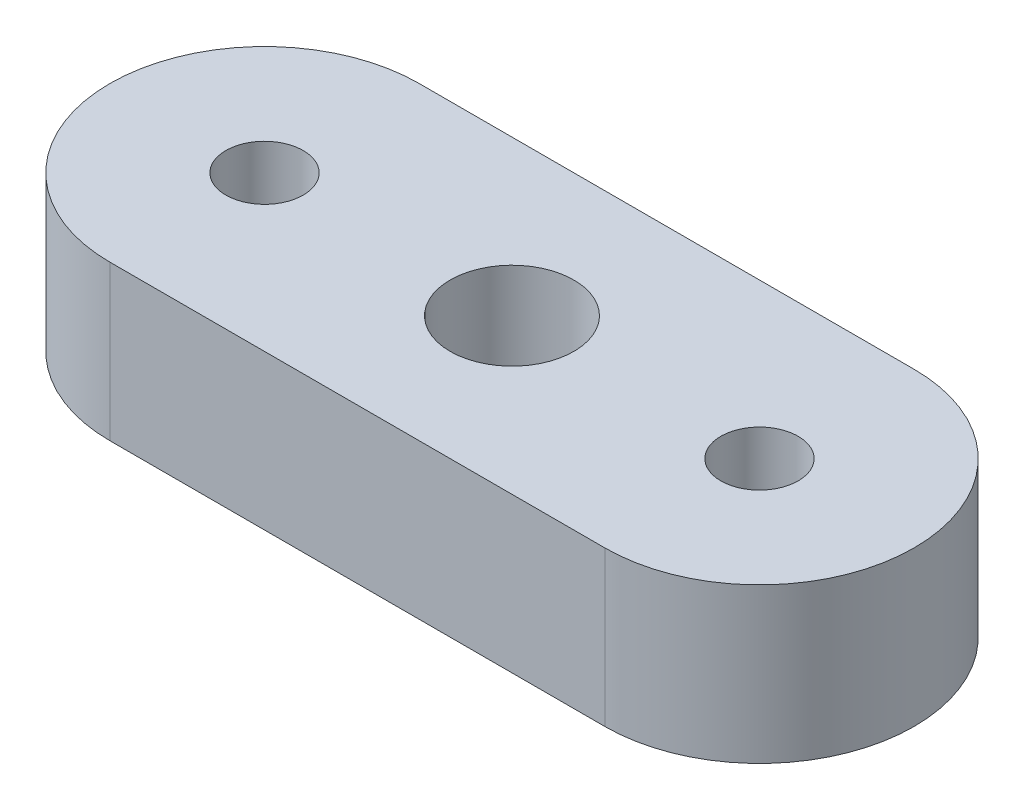
ISO-10303-21;
HEADER;
FILE_DESCRIPTION(('STEP AP214'),'2;1');
FILE_NAME('part.step','',(''),(''),'','','');
FILE_SCHEMA(('AUTOMOTIVE_DESIGN { 1 0 10303 214 1 1 1 1 }'));
ENDSEC;
DATA;
#1=APPLICATION_CONTEXT('core data for automotive mechanical design processes');
#2=APPLICATION_PROTOCOL_DEFINITION('international standard','automotive_design',2000,#1);
#3=PRODUCT_CONTEXT('',#1,'mechanical');
#4=PRODUCT('Part','Part','',(#3));
#5=PRODUCT_RELATED_PRODUCT_CATEGORY('part','',(#4));
#6=PRODUCT_DEFINITION_FORMATION('','',#4);
#7=PRODUCT_DEFINITION_CONTEXT('part definition',#1,'design');
#8=PRODUCT_DEFINITION('design','',#6,#7);
#9=PRODUCT_DEFINITION_SHAPE('','',#8);
#10=(LENGTH_UNIT() NAMED_UNIT(*) SI_UNIT(.MILLI.,.METRE.));
#11=(NAMED_UNIT(*) PLANE_ANGLE_UNIT() SI_UNIT($,.RADIAN.));
#12=(NAMED_UNIT(*) SI_UNIT($,.STERADIAN.) SOLID_ANGLE_UNIT());
#13=UNCERTAINTY_MEASURE_WITH_UNIT(LENGTH_MEASURE(1.E-05),#10,'distance_accuracy_value','');
#14=(GEOMETRIC_REPRESENTATION_CONTEXT(3) GLOBAL_UNCERTAINTY_ASSIGNED_CONTEXT((#13)) GLOBAL_UNIT_ASSIGNED_CONTEXT((#10,
#11,#12)) REPRESENTATION_CONTEXT('',''));
#15=CARTESIAN_POINT('',(0.,0.,0.));
#16=DIRECTION('',(0.,0.,1.));
#17=DIRECTION('',(1.,0.,0.));
#18=AXIS2_PLACEMENT_3D('',#15,#16,#17);
#19=CARTESIAN_POINT('',(16.,-5.,0.));
#20=DIRECTION('',(0.,1.,0.));
#21=DIRECTION('',(0.,0.,1.));
#22=AXIS2_PLACEMENT_3D('',#19,#20,#21);
#23=CYLINDRICAL_SURFACE('',#22,10.);
#24=DIRECTION('',(0.,1.,0.));
#25=VECTOR('',#24,1.);
#26=CARTESIAN_POINT('',(16.,-5.,-10.));
#27=LINE('',#26,#25);
#28=CARTESIAN_POINT('',(16.,-5.,-10.));
#29=VERTEX_POINT('',#28);
#30=CARTESIAN_POINT('',(16.,5.,-10.));
#31=VERTEX_POINT('',#30);
#32=EDGE_CURVE('E36',#29,#31,#27,.T.);
#33=ORIENTED_EDGE('',*,*,#32,.T.);
#34=CARTESIAN_POINT('',(16.,5.,0.));
#35=DIRECTION('',(0.,1.,0.));
#36=DIRECTION('',(0.,0.,1.));
#37=AXIS2_PLACEMENT_3D('',#34,#35,#36);
#38=CIRCLE('',#37,10.);
#39=CARTESIAN_POINT('',(15.9999999999999,5.,10.));
#40=VERTEX_POINT('',#39);
#41=EDGE_CURVE('E73',#40,#31,#38,.T.);
#42=ORIENTED_EDGE('',*,*,#41,.F.);
#43=DIRECTION('',(0.,1.,0.));
#44=VECTOR('',#43,1.);
#45=CARTESIAN_POINT('',(15.9999999999999,-5.,10.));
#46=LINE('',#45,#44);
#47=CARTESIAN_POINT('',(15.9999999999999,-5.,10.));
#48=VERTEX_POINT('',#47);
#49=EDGE_CURVE('E11',#48,#40,#46,.T.);
#50=ORIENTED_EDGE('',*,*,#49,.F.);
#51=CARTESIAN_POINT('',(16.,-5.,0.));
#52=DIRECTION('',(0.,1.,0.));
#53=DIRECTION('',(0.,0.,1.));
#54=AXIS2_PLACEMENT_3D('',#51,#52,#53);
#55=CIRCLE('',#54,10.);
#56=EDGE_CURVE('E74',#48,#29,#55,.T.);
#57=ORIENTED_EDGE('',*,*,#56,.T.);
#58=EDGE_LOOP('',(#33,#42,#50,#57));
#59=FACE_BOUND('',#58,.T.);
#60=ADVANCED_FACE('F33',(#59),#23,.T.);
#61=CARTESIAN_POINT('',(-16.,-5.,10.));
#62=DIRECTION('',(0.,0.,1.));
#63=DIRECTION('',(1.,0.,0.));
#64=AXIS2_PLACEMENT_3D('',#61,#62,#63);
#65=PLANE('',#64);
#66=ORIENTED_EDGE('',*,*,#49,.T.);
#67=DIRECTION('',(1.,0.,0.));
#68=VECTOR('',#67,1.);
#69=CARTESIAN_POINT('',(-16.,5.,10.));
#70=LINE('',#69,#68);
#71=CARTESIAN_POINT('',(-16.,5.,10.));
#72=VERTEX_POINT('',#71);
#73=EDGE_CURVE('E90',#72,#40,#70,.T.);
#74=ORIENTED_EDGE('',*,*,#73,.F.);
#75=DIRECTION('',(0.,1.,0.));
#76=VECTOR('',#75,1.);
#77=CARTESIAN_POINT('',(-16.,-5.,10.));
#78=LINE('',#77,#76);
#79=CARTESIAN_POINT('',(-16.,-5.,10.));
#80=VERTEX_POINT('',#79);
#81=EDGE_CURVE('E41',#80,#72,#78,.T.);
#82=ORIENTED_EDGE('',*,*,#81,.F.);
#83=DIRECTION('',(1.,0.,0.));
#84=VECTOR('',#83,1.);
#85=CARTESIAN_POINT('',(-16.,-5.,10.));
#86=LINE('',#85,#84);
#87=EDGE_CURVE('E79',#80,#48,#86,.T.);
#88=ORIENTED_EDGE('',*,*,#87,.T.);
#89=EDGE_LOOP('',(#66,#74,#82,#88));
#90=FACE_BOUND('',#89,.T.);
#91=ADVANCED_FACE('F110',(#90),#65,.T.);
#92=CARTESIAN_POINT('',(-16.,-5.,0.));
#93=DIRECTION('',(0.,1.,0.));
#94=DIRECTION('',(0.,0.,1.));
#95=AXIS2_PLACEMENT_3D('',#92,#93,#94);
#96=CYLINDRICAL_SURFACE('',#95,10.);
#97=ORIENTED_EDGE('',*,*,#81,.T.);
#98=CARTESIAN_POINT('',(-16.,5.,0.));
#99=DIRECTION('',(0.,1.,0.));
#100=DIRECTION('',(0.,0.,1.));
#101=AXIS2_PLACEMENT_3D('',#98,#99,#100);
#102=CIRCLE('',#101,10.);
#103=CARTESIAN_POINT('',(-16.,5.,-10.));
#104=VERTEX_POINT('',#103);
#105=EDGE_CURVE('E86',#104,#72,#102,.T.);
#106=ORIENTED_EDGE('',*,*,#105,.F.);
#107=DIRECTION('',(0.,1.,0.));
#108=VECTOR('',#107,1.);
#109=CARTESIAN_POINT('',(-16.,-5.,-10.));
#110=LINE('',#109,#108);
#111=CARTESIAN_POINT('',(-16.,-5.,-10.));
#112=VERTEX_POINT('',#111);
#113=EDGE_CURVE('E78',#112,#104,#110,.T.);
#114=ORIENTED_EDGE('',*,*,#113,.F.);
#115=CARTESIAN_POINT('',(-16.,-5.,0.));
#116=DIRECTION('',(0.,1.,0.));
#117=DIRECTION('',(0.,0.,1.));
#118=AXIS2_PLACEMENT_3D('',#115,#116,#117);
#119=CIRCLE('',#118,10.);
#120=EDGE_CURVE('E103',#112,#80,#119,.T.);
#121=ORIENTED_EDGE('',*,*,#120,.T.);
#122=EDGE_LOOP('',(#97,#106,#114,#121));
#123=FACE_BOUND('',#122,.T.);
#124=ADVANCED_FACE('F107',(#123),#96,.T.);
#125=CARTESIAN_POINT('',(16.,-5.,-10.));
#126=DIRECTION('',(0.,0.,-1.));
#127=DIRECTION('',(-1.,0.,0.));
#128=AXIS2_PLACEMENT_3D('',#125,#126,#127);
#129=PLANE('',#128);
#130=ORIENTED_EDGE('',*,*,#113,.T.);
#131=DIRECTION('',(-1.,0.,0.));
#132=VECTOR('',#131,1.);
#133=CARTESIAN_POINT('',(16.,5.,-10.));
#134=LINE('',#133,#132);
#135=EDGE_CURVE('E81',#31,#104,#134,.T.);
#136=ORIENTED_EDGE('',*,*,#135,.F.);
#137=ORIENTED_EDGE('',*,*,#32,.F.);
#138=DIRECTION('',(-1.,0.,0.));
#139=VECTOR('',#138,1.);
#140=CARTESIAN_POINT('',(16.,-5.,-10.));
#141=LINE('',#140,#139);
#142=EDGE_CURVE('E101',#29,#112,#141,.T.);
#143=ORIENTED_EDGE('',*,*,#142,.T.);
#144=EDGE_LOOP('',(#130,#136,#137,#143));
#145=FACE_BOUND('',#144,.T.);
#146=ADVANCED_FACE('F82',(#145),#129,.T.);
#147=CARTESIAN_POINT('',(16.,-5.,0.));
#148=DIRECTION('',(0.,1.,0.));
#149=DIRECTION('',(0.,0.,1.));
#150=AXIS2_PLACEMENT_3D('',#147,#148,#149);
#151=PLANE('',#150);
#152=CARTESIAN_POINT('',(-16.,-5.,0.));
#153=DIRECTION('',(0.,1.,0.));
#154=DIRECTION('',(0.,0.,1.));
#155=AXIS2_PLACEMENT_3D('',#152,#153,#154);
#156=CIRCLE('',#155,2.5);
#157=CARTESIAN_POINT('',(-16.,-5.,2.5));
#158=VERTEX_POINT('',#157);
#159=EDGE_CURVE('E188',#158,#158,#156,.T.);
#160=ORIENTED_EDGE('',*,*,#159,.T.);
#161=EDGE_LOOP('',(#160));
#162=FACE_BOUND('',#161,.T.);
#163=CARTESIAN_POINT('',(16.,-5.,0.));
#164=DIRECTION('',(0.,1.,0.));
#165=DIRECTION('',(0.,0.,1.));
#166=AXIS2_PLACEMENT_3D('',#163,#164,#165);
#167=CIRCLE('',#166,2.5);
#168=CARTESIAN_POINT('',(16.,-5.,2.5));
#169=VERTEX_POINT('',#168);
#170=EDGE_CURVE('E190',#169,#169,#167,.T.);
#171=ORIENTED_EDGE('',*,*,#170,.T.);
#172=EDGE_LOOP('',(#171));
#173=FACE_BOUND('',#172,.T.);
#174=CARTESIAN_POINT('',(0.,-5.,0.));
#175=DIRECTION('',(0.,1.,0.));
#176=DIRECTION('',(0.,0.,1.));
#177=AXIS2_PLACEMENT_3D('',#174,#175,#176);
#178=CIRCLE('',#177,4.);
#179=CARTESIAN_POINT('',(0.,-5.,4.));
#180=VERTEX_POINT('',#179);
#181=EDGE_CURVE('E94',#180,#180,#178,.T.);
#182=ORIENTED_EDGE('',*,*,#181,.T.);
#183=EDGE_LOOP('',(#182));
#184=FACE_BOUND('',#183,.T.);
#185=ORIENTED_EDGE('',*,*,#56,.F.);
#186=ORIENTED_EDGE('',*,*,#87,.F.);
#187=ORIENTED_EDGE('',*,*,#120,.F.);
#188=ORIENTED_EDGE('',*,*,#142,.F.);
#189=EDGE_LOOP('',(#185,#186,#187,#188));
#190=FACE_BOUND('',#189,.T.);
#191=ADVANCED_FACE('F112',(#162,#173,#184,#190),#151,.F.);
#192=CARTESIAN_POINT('',(16.,5.,0.));
#193=DIRECTION('',(0.,1.,0.));
#194=DIRECTION('',(0.,0.,1.));
#195=AXIS2_PLACEMENT_3D('',#192,#193,#194);
#196=PLANE('',#195);
#197=CARTESIAN_POINT('',(-16.,5.,0.));
#198=DIRECTION('',(0.,1.,0.));
#199=DIRECTION('',(0.,0.,1.));
#200=AXIS2_PLACEMENT_3D('',#197,#198,#199);
#201=CIRCLE('',#200,2.5);
#202=CARTESIAN_POINT('',(-16.,5.,2.5));
#203=VERTEX_POINT('',#202);
#204=EDGE_CURVE('E186',#203,#203,#201,.T.);
#205=ORIENTED_EDGE('',*,*,#204,.F.);
#206=EDGE_LOOP('',(#205));
#207=FACE_BOUND('',#206,.T.);
#208=CARTESIAN_POINT('',(16.,5.,0.));
#209=DIRECTION('',(0.,1.,0.));
#210=DIRECTION('',(0.,0.,1.));
#211=AXIS2_PLACEMENT_3D('',#208,#209,#210);
#212=CIRCLE('',#211,2.5);
#213=CARTESIAN_POINT('',(16.,5.,2.5));
#214=VERTEX_POINT('',#213);
#215=EDGE_CURVE('E193',#214,#214,#212,.T.);
#216=ORIENTED_EDGE('',*,*,#215,.F.);
#217=EDGE_LOOP('',(#216));
#218=FACE_BOUND('',#217,.T.);
#219=CARTESIAN_POINT('',(0.,5.,0.));
#220=DIRECTION('',(0.,1.,0.));
#221=DIRECTION('',(0.,0.,1.));
#222=AXIS2_PLACEMENT_3D('',#219,#220,#221);
#223=CIRCLE('',#222,4.);
#224=CARTESIAN_POINT('',(0.,5.,4.));
#225=VERTEX_POINT('',#224);
#226=EDGE_CURVE('E91',#225,#225,#223,.T.);
#227=ORIENTED_EDGE('',*,*,#226,.F.);
#228=EDGE_LOOP('',(#227));
#229=FACE_BOUND('',#228,.T.);
#230=ORIENTED_EDGE('',*,*,#41,.T.);
#231=ORIENTED_EDGE('',*,*,#135,.T.);
#232=ORIENTED_EDGE('',*,*,#105,.T.);
#233=ORIENTED_EDGE('',*,*,#73,.T.);
#234=EDGE_LOOP('',(#230,#231,#232,#233));
#235=FACE_BOUND('',#234,.T.);
#236=ADVANCED_FACE('F89',(#207,#218,#229,#235),#196,.T.);
#237=CARTESIAN_POINT('',(0.,5.,0.));
#238=DIRECTION('',(0.,-1.,0.));
#239=DIRECTION('',(0.,0.,-1.));
#240=AXIS2_PLACEMENT_3D('',#237,#238,#239);
#241=CYLINDRICAL_SURFACE('',#240,4.);
#242=ORIENTED_EDGE('',*,*,#226,.T.);
#243=EDGE_LOOP('',(#242));
#244=FACE_BOUND('',#243,.T.);
#245=ORIENTED_EDGE('',*,*,#181,.F.);
#246=EDGE_LOOP('',(#245));
#247=FACE_BOUND('',#246,.T.);
#248=ADVANCED_FACE('F120',(#244,#247),#241,.F.);
#249=CARTESIAN_POINT('',(16.,5.,0.));
#250=DIRECTION('',(0.,-1.,0.));
#251=DIRECTION('',(0.,0.,-1.));
#252=AXIS2_PLACEMENT_3D('',#249,#250,#251);
#253=CYLINDRICAL_SURFACE('',#252,2.5);
#254=ORIENTED_EDGE('',*,*,#215,.T.);
#255=EDGE_LOOP('',(#254));
#256=FACE_BOUND('',#255,.T.);
#257=ORIENTED_EDGE('',*,*,#170,.F.);
#258=EDGE_LOOP('',(#257));
#259=FACE_BOUND('',#258,.T.);
#260=ADVANCED_FACE('F159',(#256,#259),#253,.F.);
#261=CARTESIAN_POINT('',(-16.,5.,0.));
#262=DIRECTION('',(0.,-1.,0.));
#263=DIRECTION('',(0.,0.,-1.));
#264=AXIS2_PLACEMENT_3D('',#261,#262,#263);
#265=CYLINDRICAL_SURFACE('',#264,2.5);
#266=ORIENTED_EDGE('',*,*,#204,.T.);
#267=EDGE_LOOP('',(#266));
#268=FACE_BOUND('',#267,.T.);
#269=ORIENTED_EDGE('',*,*,#159,.F.);
#270=EDGE_LOOP('',(#269));
#271=FACE_BOUND('',#270,.T.);
#272=ADVANCED_FACE('F169',(#268,#271),#265,.F.);
#273=CLOSED_SHELL('',(#60,#91,#124,#146,#191,#236,#248,#260,#272));
#274=MANIFOLD_SOLID_BREP('B2',#273);
#275=ADVANCED_BREP_SHAPE_REPRESENTATION('',(#18,#274),#14);
#276=SHAPE_DEFINITION_REPRESENTATION(#9,#275);
ENDSEC;
END-ISO-10303-21;
